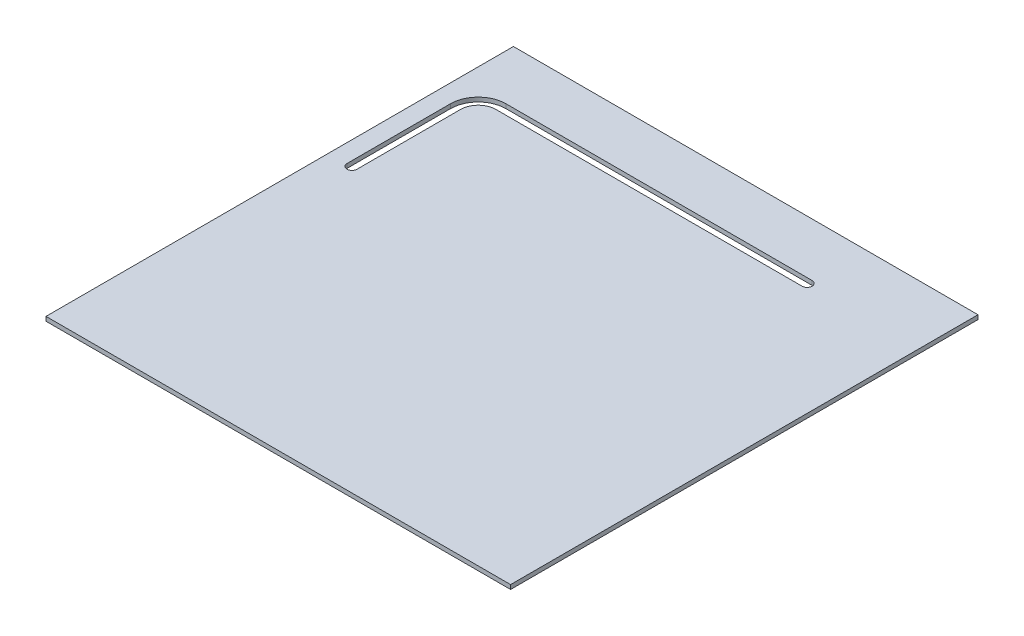
ISO-10303-21;
HEADER;
FILE_DESCRIPTION(('STEP AP214'),'2;1');
FILE_NAME('part.step','',(''),(''),'','','');
FILE_SCHEMA(('AUTOMOTIVE_DESIGN { 1 0 10303 214 1 1 1 1 }'));
ENDSEC;
DATA;
#1=APPLICATION_CONTEXT('core data for automotive mechanical design processes');
#2=APPLICATION_PROTOCOL_DEFINITION('international standard','automotive_design',2000,#1);
#3=PRODUCT_CONTEXT('',#1,'mechanical');
#4=PRODUCT('Part','Part','',(#3));
#5=PRODUCT_RELATED_PRODUCT_CATEGORY('part','',(#4));
#6=PRODUCT_DEFINITION_FORMATION('','',#4);
#7=PRODUCT_DEFINITION_CONTEXT('part definition',#1,'design');
#8=PRODUCT_DEFINITION('design','',#6,#7);
#9=PRODUCT_DEFINITION_SHAPE('','',#8);
#10=(LENGTH_UNIT() NAMED_UNIT(*) SI_UNIT(.MILLI.,.METRE.));
#11=(NAMED_UNIT(*) PLANE_ANGLE_UNIT() SI_UNIT($,.RADIAN.));
#12=(NAMED_UNIT(*) SI_UNIT($,.STERADIAN.) SOLID_ANGLE_UNIT());
#13=UNCERTAINTY_MEASURE_WITH_UNIT(LENGTH_MEASURE(1.E-05),#10,'distance_accuracy_value','');
#14=(GEOMETRIC_REPRESENTATION_CONTEXT(3) GLOBAL_UNCERTAINTY_ASSIGNED_CONTEXT((#13)) GLOBAL_UNIT_ASSIGNED_CONTEXT((#10,
#11,#12)) REPRESENTATION_CONTEXT('',''));
#15=CARTESIAN_POINT('',(0.,0.,0.));
#16=DIRECTION('',(0.,0.,1.));
#17=DIRECTION('',(1.,0.,0.));
#18=AXIS2_PLACEMENT_3D('',#15,#16,#17);
#19=CARTESIAN_POINT('',(0.,12.,0.));
#20=DIRECTION('',(0.,1.,0.));
#21=DIRECTION('',(0.,0.,-1.));
#22=AXIS2_PLACEMENT_3D('',#19,#20,#21);
#23=PLANE('',#22);
#24=CARTESIAN_POINT('',(190.5,12.,66.27));
#25=DIRECTION('',(0.,1.,0.));
#26=DIRECTION('',(0.,0.,1.));
#27=AXIS2_PLACEMENT_3D('',#24,#25,#26);
#28=CIRCLE('',#27,2.5);
#29=CARTESIAN_POINT('',(190.5,12.,68.77));
#30=VERTEX_POINT('',#29);
#31=EDGE_CURVE('E235',#30,#30,#28,.T.);
#32=ORIENTED_EDGE('',*,*,#31,.T.);
#33=EDGE_LOOP('',(#32));
#34=FACE_BOUND('',#33,.T.);
#35=CARTESIAN_POINT('',(135.5,12.,66.27));
#36=DIRECTION('',(0.,1.,0.));
#37=DIRECTION('',(0.,0.,1.));
#38=AXIS2_PLACEMENT_3D('',#35,#36,#37);
#39=CIRCLE('',#38,2.5);
#40=CARTESIAN_POINT('',(135.5,12.,68.77));
#41=VERTEX_POINT('',#40);
#42=EDGE_CURVE('E229',#41,#41,#39,.T.);
#43=ORIENTED_EDGE('',*,*,#42,.T.);
#44=EDGE_LOOP('',(#43));
#45=FACE_BOUND('',#44,.T.);
#46=CARTESIAN_POINT('',(80.5,12.,66.27));
#47=DIRECTION('',(0.,1.,0.));
#48=DIRECTION('',(0.,0.,1.));
#49=AXIS2_PLACEMENT_3D('',#46,#47,#48);
#50=CIRCLE('',#49,2.5);
#51=CARTESIAN_POINT('',(80.5,12.,68.77));
#52=VERTEX_POINT('',#51);
#53=EDGE_CURVE('E223',#52,#52,#50,.T.);
#54=ORIENTED_EDGE('',*,*,#53,.T.);
#55=EDGE_LOOP('',(#54));
#56=FACE_BOUND('',#55,.T.);
#57=CARTESIAN_POINT('',(25.5,12.,66.27));
#58=DIRECTION('',(0.,1.,0.));
#59=DIRECTION('',(0.,0.,1.));
#60=AXIS2_PLACEMENT_3D('',#57,#58,#59);
#61=CIRCLE('',#60,2.5);
#62=CARTESIAN_POINT('',(25.5,12.,68.77));
#63=VERTEX_POINT('',#62);
#64=EDGE_CURVE('E217',#63,#63,#61,.T.);
#65=ORIENTED_EDGE('',*,*,#64,.T.);
#66=EDGE_LOOP('',(#65));
#67=FACE_BOUND('',#66,.T.);
#68=CARTESIAN_POINT('',(-29.5,12.,66.27));
#69=DIRECTION('',(0.,1.,0.));
#70=DIRECTION('',(0.,0.,1.));
#71=AXIS2_PLACEMENT_3D('',#68,#69,#70);
#72=CIRCLE('',#71,2.5);
#73=CARTESIAN_POINT('',(-29.5,12.,68.77));
#74=VERTEX_POINT('',#73);
#75=EDGE_CURVE('E211',#74,#74,#72,.T.);
#76=ORIENTED_EDGE('',*,*,#75,.T.);
#77=EDGE_LOOP('',(#76));
#78=FACE_BOUND('',#77,.T.);
#79=CARTESIAN_POINT('',(-84.5,12.,66.27));
#80=DIRECTION('',(0.,1.,0.));
#81=DIRECTION('',(0.,0.,1.));
#82=AXIS2_PLACEMENT_3D('',#79,#80,#81);
#83=CIRCLE('',#82,2.5);
#84=CARTESIAN_POINT('',(-84.5,12.,68.77));
#85=VERTEX_POINT('',#84);
#86=EDGE_CURVE('E205',#85,#85,#83,.T.);
#87=ORIENTED_EDGE('',*,*,#86,.T.);
#88=EDGE_LOOP('',(#87));
#89=FACE_BOUND('',#88,.T.);
#90=CARTESIAN_POINT('',(-139.5,12.,66.27));
#91=DIRECTION('',(0.,1.,0.));
#92=DIRECTION('',(0.,0.,1.));
#93=AXIS2_PLACEMENT_3D('',#90,#91,#92);
#94=CIRCLE('',#93,2.5);
#95=CARTESIAN_POINT('',(-139.5,12.,68.77));
#96=VERTEX_POINT('',#95);
#97=EDGE_CURVE('E176',#96,#96,#94,.T.);
#98=ORIENTED_EDGE('',*,*,#97,.T.);
#99=EDGE_LOOP('',(#98));
#100=FACE_BOUND('',#99,.T.);
#101=CARTESIAN_POINT('',(-235.5,12.,-239.73));
#102=DIRECTION('',(0.,1.,0.));
#103=DIRECTION('',(0.,0.,1.));
#104=AXIS2_PLACEMENT_3D('',#101,#102,#103);
#105=CIRCLE('',#104,25.);
#106=CARTESIAN_POINT('',(-235.5,12.,-264.73));
#107=VERTEX_POINT('',#106);
#108=CARTESIAN_POINT('',(-260.5,12.,-239.73));
#109=VERTEX_POINT('',#108);
#110=EDGE_CURVE('E196',#107,#109,#105,.T.);
#111=ORIENTED_EDGE('',*,*,#110,.F.);
#112=DIRECTION('',(-1.,0.,0.));
#113=VECTOR('',#112,1.);
#114=CARTESIAN_POINT('',(0.,12.,-264.73));
#115=LINE('',#114,#113);
#116=CARTESIAN_POINT('',(195.5,12.,-264.73));
#117=VERTEX_POINT('',#116);
#118=EDGE_CURVE('E193',#117,#107,#115,.T.);
#119=ORIENTED_EDGE('',*,*,#118,.F.);
#120=CARTESIAN_POINT('',(195.5,12.,-271.73));
#121=DIRECTION('',(0.,1.,0.));
#122=DIRECTION('',(0.,0.,1.));
#123=AXIS2_PLACEMENT_3D('',#120,#121,#122);
#124=CIRCLE('',#123,7.);
#125=CARTESIAN_POINT('',(195.5,12.,-278.73));
#126=VERTEX_POINT('',#125);
#127=EDGE_CURVE('E190',#126,#117,#124,.F.);
#128=ORIENTED_EDGE('',*,*,#127,.F.);
#129=DIRECTION('',(-1.,0.,0.));
#130=VECTOR('',#129,1.);
#131=CARTESIAN_POINT('',(0.,12.,-278.73));
#132=LINE('',#131,#130);
#133=CARTESIAN_POINT('',(-235.5,12.,-278.73));
#134=VERTEX_POINT('',#133);
#135=EDGE_CURVE('E187',#126,#134,#132,.T.);
#136=ORIENTED_EDGE('',*,*,#135,.T.);
#137=CARTESIAN_POINT('',(-235.5,12.,-239.73));
#138=DIRECTION('',(0.,1.,0.));
#139=DIRECTION('',(0.,0.,1.));
#140=AXIS2_PLACEMENT_3D('',#137,#138,#139);
#141=CIRCLE('',#140,39.);
#142=CARTESIAN_POINT('',(-274.5,12.,-239.73));
#143=VERTEX_POINT('',#142);
#144=EDGE_CURVE('E184',#134,#143,#141,.T.);
#145=ORIENTED_EDGE('',*,*,#144,.T.);
#146=DIRECTION('',(0.,0.,1.));
#147=VECTOR('',#146,1.);
#148=CARTESIAN_POINT('',(-274.5,12.,-1.04593624815928E-13));
#149=LINE('',#148,#147);
#150=CARTESIAN_POINT('',(-274.5,12.,-94.0441511751126));
#151=VERTEX_POINT('',#150);
#152=EDGE_CURVE('E181',#143,#151,#149,.T.);
#153=ORIENTED_EDGE('',*,*,#152,.T.);
#154=CARTESIAN_POINT('',(-267.5,12.,-94.0441511751126));
#155=DIRECTION('',(0.,1.,0.));
#156=DIRECTION('',(0.,0.,1.));
#157=AXIS2_PLACEMENT_3D('',#154,#155,#156);
#158=CIRCLE('',#157,7.);
#159=CARTESIAN_POINT('',(-260.5,12.,-94.0441511751126));
#160=VERTEX_POINT('',#159);
#161=EDGE_CURVE('E178',#151,#160,#158,.T.);
#162=ORIENTED_EDGE('',*,*,#161,.T.);
#163=DIRECTION('',(0.,0.,-1.));
#164=VECTOR('',#163,1.);
#165=CARTESIAN_POINT('',(-260.5,12.,0.));
#166=LINE('',#165,#164);
#167=EDGE_CURVE('E163',#160,#109,#166,.T.);
#168=ORIENTED_EDGE('',*,*,#167,.T.);
#169=EDGE_LOOP('',(#111,#119,#128,#136,#145,#153,#162,#168));
#170=FACE_BOUND('',#169,.T.);
#171=DIRECTION('',(0.,0.,-1.));
#172=VECTOR('',#171,1.);
#173=CARTESIAN_POINT('',(354.,12.,304.23));
#174=LINE('',#173,#172);
#175=CARTESIAN_POINT('',(354.,12.,304.23));
#176=VERTEX_POINT('',#175);
#177=CARTESIAN_POINT('',(354.,12.,-353.77));
#178=VERTEX_POINT('',#177);
#179=EDGE_CURVE('E120',#176,#178,#174,.T.);
#180=ORIENTED_EDGE('',*,*,#179,.F.);
#181=DIRECTION('',(1.,0.,0.));
#182=VECTOR('',#181,1.);
#183=CARTESIAN_POINT('',(-300.,12.,304.23));
#184=LINE('',#183,#182);
#185=CARTESIAN_POINT('',(-300.,12.,304.23));
#186=VERTEX_POINT('',#185);
#187=EDGE_CURVE('E25',#186,#176,#184,.T.);
#188=ORIENTED_EDGE('',*,*,#187,.F.);
#189=DIRECTION('',(0.,0.,1.));
#190=VECTOR('',#189,1.);
#191=CARTESIAN_POINT('',(-300.,12.,304.23));
#192=LINE('',#191,#190);
#193=CARTESIAN_POINT('',(-300.,12.,-353.77));
#194=VERTEX_POINT('',#193);
#195=EDGE_CURVE('E115',#194,#186,#192,.T.);
#196=ORIENTED_EDGE('',*,*,#195,.F.);
#197=DIRECTION('',(-1.,0.,0.));
#198=VECTOR('',#197,1.);
#199=CARTESIAN_POINT('',(354.,12.,-353.77));
#200=LINE('',#199,#198);
#201=EDGE_CURVE('E125',#178,#194,#200,.T.);
#202=ORIENTED_EDGE('',*,*,#201,.F.);
#203=EDGE_LOOP('',(#180,#188,#196,#202));
#204=FACE_BOUND('',#203,.T.);
#205=ADVANCED_FACE('F17',(#34,#45,#56,#67,#78,#89,#100,#170,#204),#23,.F.);
#206=CARTESIAN_POINT('',(-300.,12.,304.23));
#207=DIRECTION('',(1.,0.,0.));
#208=DIRECTION('',(0.,0.,-1.));
#209=AXIS2_PLACEMENT_3D('',#206,#207,#208);
#210=PLANE('',#209);
#211=DIRECTION('',(0.,0.,1.));
#212=VECTOR('',#211,1.);
#213=CARTESIAN_POINT('',(-300.,18.,304.23));
#214=LINE('',#213,#212);
#215=CARTESIAN_POINT('',(-300.,18.,-353.77));
#216=VERTEX_POINT('',#215);
#217=CARTESIAN_POINT('',(-300.,18.,304.23));
#218=VERTEX_POINT('',#217);
#219=EDGE_CURVE('E199',#216,#218,#214,.T.);
#220=ORIENTED_EDGE('',*,*,#219,.F.);
#221=DIRECTION('',(0.,1.,0.));
#222=VECTOR('',#221,1.);
#223=CARTESIAN_POINT('',(-300.,12.,-353.77));
#224=LINE('',#223,#222);
#225=EDGE_CURVE('E135',#194,#216,#224,.T.);
#226=ORIENTED_EDGE('',*,*,#225,.F.);
#227=ORIENTED_EDGE('',*,*,#195,.T.);
#228=DIRECTION('',(0.,1.,0.));
#229=VECTOR('',#228,1.);
#230=CARTESIAN_POINT('',(-300.,12.,304.23));
#231=LINE('',#230,#229);
#232=EDGE_CURVE('E11',#186,#218,#231,.T.);
#233=ORIENTED_EDGE('',*,*,#232,.T.);
#234=EDGE_LOOP('',(#220,#226,#227,#233));
#235=FACE_BOUND('',#234,.T.);
#236=ADVANCED_FACE('F19',(#235),#210,.F.);
#237=CARTESIAN_POINT('',(-300.,12.,304.23));
#238=DIRECTION('',(0.,0.,-1.));
#239=DIRECTION('',(-1.,0.,0.));
#240=AXIS2_PLACEMENT_3D('',#237,#238,#239);
#241=PLANE('',#240);
#242=DIRECTION('',(1.,0.,0.));
#243=VECTOR('',#242,1.);
#244=CARTESIAN_POINT('',(-300.,18.,304.23));
#245=LINE('',#244,#243);
#246=CARTESIAN_POINT('',(354.,18.,304.23));
#247=VERTEX_POINT('',#246);
#248=EDGE_CURVE('E240',#218,#247,#245,.T.);
#249=ORIENTED_EDGE('',*,*,#248,.F.);
#250=ORIENTED_EDGE('',*,*,#232,.F.);
#251=ORIENTED_EDGE('',*,*,#187,.T.);
#252=DIRECTION('',(0.,1.,0.));
#253=VECTOR('',#252,1.);
#254=CARTESIAN_POINT('',(354.,12.,304.23));
#255=LINE('',#254,#253);
#256=EDGE_CURVE('E110',#176,#247,#255,.T.);
#257=ORIENTED_EDGE('',*,*,#256,.T.);
#258=EDGE_LOOP('',(#249,#250,#251,#257));
#259=FACE_BOUND('',#258,.T.);
#260=ADVANCED_FACE('F109',(#259),#241,.F.);
#261=CARTESIAN_POINT('',(0.,18.,0.));
#262=DIRECTION('',(0.,1.,0.));
#263=DIRECTION('',(0.,0.,-1.));
#264=AXIS2_PLACEMENT_3D('',#261,#262,#263);
#265=PLANE('',#264);
#266=CARTESIAN_POINT('',(195.5,18.,-271.73));
#267=DIRECTION('',(0.,1.,0.));
#268=DIRECTION('',(0.,0.,1.));
#269=AXIS2_PLACEMENT_3D('',#266,#267,#268);
#270=CIRCLE('',#269,7.);
#271=CARTESIAN_POINT('',(195.5,18.,-264.73));
#272=VERTEX_POINT('',#271);
#273=CARTESIAN_POINT('',(195.5,18.,-278.73));
#274=VERTEX_POINT('',#273);
#275=EDGE_CURVE('E138',#272,#274,#270,.T.);
#276=ORIENTED_EDGE('',*,*,#275,.F.);
#277=DIRECTION('',(1.,0.,0.));
#278=VECTOR('',#277,1.);
#279=CARTESIAN_POINT('',(195.5,18.,-264.73));
#280=LINE('',#279,#278);
#281=CARTESIAN_POINT('',(-235.5,18.,-264.73));
#282=VERTEX_POINT('',#281);
#283=EDGE_CURVE('E157',#282,#272,#280,.T.);
#284=ORIENTED_EDGE('',*,*,#283,.F.);
#285=CARTESIAN_POINT('',(-235.5,18.,-239.73));
#286=DIRECTION('',(0.,-1.,0.));
#287=DIRECTION('',(0.,0.,1.));
#288=AXIS2_PLACEMENT_3D('',#285,#286,#287);
#289=CIRCLE('',#288,25.);
#290=CARTESIAN_POINT('',(-260.5,18.,-239.73));
#291=VERTEX_POINT('',#290);
#292=EDGE_CURVE('E154',#291,#282,#289,.T.);
#293=ORIENTED_EDGE('',*,*,#292,.F.);
#294=DIRECTION('',(0.,0.,-1.));
#295=VECTOR('',#294,1.);
#296=CARTESIAN_POINT('',(-260.5,18.,-94.0441511751126));
#297=LINE('',#296,#295);
#298=CARTESIAN_POINT('',(-260.5,18.,-94.0441511751126));
#299=VERTEX_POINT('',#298);
#300=EDGE_CURVE('E152',#299,#291,#297,.T.);
#301=ORIENTED_EDGE('',*,*,#300,.F.);
#302=CARTESIAN_POINT('',(-267.5,18.,-94.0441511751126));
#303=DIRECTION('',(0.,1.,0.));
#304=DIRECTION('',(0.,0.,1.));
#305=AXIS2_PLACEMENT_3D('',#302,#303,#304);
#306=CIRCLE('',#305,7.);
#307=CARTESIAN_POINT('',(-274.5,18.,-94.0441511751126));
#308=VERTEX_POINT('',#307);
#309=EDGE_CURVE('E149',#308,#299,#306,.T.);
#310=ORIENTED_EDGE('',*,*,#309,.F.);
#311=DIRECTION('',(0.,0.,1.));
#312=VECTOR('',#311,1.);
#313=CARTESIAN_POINT('',(-274.5,18.,-239.73));
#314=LINE('',#313,#312);
#315=CARTESIAN_POINT('',(-274.5,18.,-239.73));
#316=VERTEX_POINT('',#315);
#317=EDGE_CURVE('E146',#316,#308,#314,.T.);
#318=ORIENTED_EDGE('',*,*,#317,.F.);
#319=CARTESIAN_POINT('',(-235.5,18.,-239.73));
#320=DIRECTION('',(0.,1.,0.));
#321=DIRECTION('',(0.,0.,1.));
#322=AXIS2_PLACEMENT_3D('',#319,#320,#321);
#323=CIRCLE('',#322,39.);
#324=CARTESIAN_POINT('',(-235.5,18.,-278.73));
#325=VERTEX_POINT('',#324);
#326=EDGE_CURVE('E144',#325,#316,#323,.T.);
#327=ORIENTED_EDGE('',*,*,#326,.F.);
#328=DIRECTION('',(-1.,0.,0.));
#329=VECTOR('',#328,1.);
#330=CARTESIAN_POINT('',(-235.5,18.,-278.73));
#331=LINE('',#330,#329);
#332=EDGE_CURVE('E142',#274,#325,#331,.T.);
#333=ORIENTED_EDGE('',*,*,#332,.F.);
#334=EDGE_LOOP('',(#276,#284,#293,#301,#310,#318,#327,#333));
#335=FACE_BOUND('',#334,.T.);
#336=ORIENTED_EDGE('',*,*,#248,.T.);
#337=DIRECTION('',(0.,0.,-1.));
#338=VECTOR('',#337,1.);
#339=CARTESIAN_POINT('',(354.,18.,304.23));
#340=LINE('',#339,#338);
#341=CARTESIAN_POINT('',(354.,18.,-353.77));
#342=VERTEX_POINT('',#341);
#343=EDGE_CURVE('E123',#247,#342,#340,.T.);
#344=ORIENTED_EDGE('',*,*,#343,.T.);
#345=DIRECTION('',(-1.,0.,0.));
#346=VECTOR('',#345,1.);
#347=CARTESIAN_POINT('',(354.,18.,-353.77));
#348=LINE('',#347,#346);
#349=EDGE_CURVE('E128',#342,#216,#348,.T.);
#350=ORIENTED_EDGE('',*,*,#349,.T.);
#351=ORIENTED_EDGE('',*,*,#219,.T.);
#352=EDGE_LOOP('',(#336,#344,#350,#351));
#353=FACE_BOUND('',#352,.T.);
#354=ADVANCED_FACE('F244',(#335,#353),#265,.T.);
#355=CARTESIAN_POINT('',(-260.5,14.,0.));
#356=DIRECTION('',(1.,0.,0.));
#357=DIRECTION('',(0.,0.,-1.));
#358=AXIS2_PLACEMENT_3D('',#355,#356,#357);
#359=PLANE('',#358);
#360=ORIENTED_EDGE('',*,*,#167,.F.);
#361=DIRECTION('',(0.,-1.,0.));
#362=VECTOR('',#361,1.);
#363=CARTESIAN_POINT('',(-260.5,14.,-94.0441511751126));
#364=LINE('',#363,#362);
#365=EDGE_CURVE('E173',#299,#160,#364,.T.);
#366=ORIENTED_EDGE('',*,*,#365,.F.);
#367=ORIENTED_EDGE('',*,*,#300,.T.);
#368=DIRECTION('',(0.,-1.,0.));
#369=VECTOR('',#368,1.);
#370=CARTESIAN_POINT('',(-260.5,14.,-239.73));
#371=LINE('',#370,#369);
#372=EDGE_CURVE('E40',#291,#109,#371,.T.);
#373=ORIENTED_EDGE('',*,*,#372,.T.);
#374=EDGE_LOOP('',(#360,#366,#367,#373));
#375=FACE_BOUND('',#374,.T.);
#376=ADVANCED_FACE('F274',(#375),#359,.F.);
#377=CARTESIAN_POINT('',(-267.5,14.,-94.0441511751126));
#378=DIRECTION('',(0.,-1.,0.));
#379=DIRECTION('',(0.,0.,1.));
#380=AXIS2_PLACEMENT_3D('',#377,#378,#379);
#381=CYLINDRICAL_SURFACE('',#380,7.);
#382=ORIENTED_EDGE('',*,*,#161,.F.);
#383=DIRECTION('',(0.,-1.,0.));
#384=VECTOR('',#383,1.);
#385=CARTESIAN_POINT('',(-274.5,14.,-94.0441511751126));
#386=LINE('',#385,#384);
#387=EDGE_CURVE('E171',#308,#151,#386,.T.);
#388=ORIENTED_EDGE('',*,*,#387,.F.);
#389=ORIENTED_EDGE('',*,*,#309,.T.);
#390=ORIENTED_EDGE('',*,*,#365,.T.);
#391=EDGE_LOOP('',(#382,#388,#389,#390));
#392=FACE_BOUND('',#391,.T.);
#393=ADVANCED_FACE('F298',(#392),#381,.F.);
#394=CARTESIAN_POINT('',(-274.5,14.,-1.04593624815928E-13));
#395=DIRECTION('',(-1.,0.,0.));
#396=DIRECTION('',(0.,0.,1.));
#397=AXIS2_PLACEMENT_3D('',#394,#395,#396);
#398=PLANE('',#397);
#399=ORIENTED_EDGE('',*,*,#152,.F.);
#400=DIRECTION('',(0.,-1.,0.));
#401=VECTOR('',#400,1.);
#402=CARTESIAN_POINT('',(-274.5,14.,-239.73));
#403=LINE('',#402,#401);
#404=EDGE_CURVE('E169',#316,#143,#403,.T.);
#405=ORIENTED_EDGE('',*,*,#404,.F.);
#406=ORIENTED_EDGE('',*,*,#317,.T.);
#407=ORIENTED_EDGE('',*,*,#387,.T.);
#408=EDGE_LOOP('',(#399,#405,#406,#407));
#409=FACE_BOUND('',#408,.T.);
#410=ADVANCED_FACE('F306',(#409),#398,.F.);
#411=CARTESIAN_POINT('',(-235.5,14.,-239.73));
#412=DIRECTION('',(0.,-1.,0.));
#413=DIRECTION('',(0.,0.,1.));
#414=AXIS2_PLACEMENT_3D('',#411,#412,#413);
#415=CYLINDRICAL_SURFACE('',#414,39.);
#416=ORIENTED_EDGE('',*,*,#144,.F.);
#417=DIRECTION('',(0.,-1.,0.));
#418=VECTOR('',#417,1.);
#419=CARTESIAN_POINT('',(-235.5,14.,-278.73));
#420=LINE('',#419,#418);
#421=EDGE_CURVE('E32',#325,#134,#420,.T.);
#422=ORIENTED_EDGE('',*,*,#421,.F.);
#423=ORIENTED_EDGE('',*,*,#326,.T.);
#424=ORIENTED_EDGE('',*,*,#404,.T.);
#425=EDGE_LOOP('',(#416,#422,#423,#424));
#426=FACE_BOUND('',#425,.T.);
#427=ADVANCED_FACE('F315',(#426),#415,.F.);
#428=CARTESIAN_POINT('',(0.,14.,-278.73));
#429=DIRECTION('',(0.,0.,-1.));
#430=DIRECTION('',(-1.,0.,0.));
#431=AXIS2_PLACEMENT_3D('',#428,#429,#430);
#432=PLANE('',#431);
#433=ORIENTED_EDGE('',*,*,#135,.F.);
#434=DIRECTION('',(0.,-1.,0.));
#435=VECTOR('',#434,1.);
#436=CARTESIAN_POINT('',(195.5,14.,-278.73));
#437=LINE('',#436,#435);
#438=EDGE_CURVE('E166',#274,#126,#437,.T.);
#439=ORIENTED_EDGE('',*,*,#438,.F.);
#440=ORIENTED_EDGE('',*,*,#332,.T.);
#441=ORIENTED_EDGE('',*,*,#421,.T.);
#442=EDGE_LOOP('',(#433,#439,#440,#441));
#443=FACE_BOUND('',#442,.T.);
#444=ADVANCED_FACE('F324',(#443),#432,.F.);
#445=CARTESIAN_POINT('',(195.5,14.,-271.73));
#446=DIRECTION('',(0.,-1.,0.));
#447=DIRECTION('',(0.,0.,1.));
#448=AXIS2_PLACEMENT_3D('',#445,#446,#447);
#449=CYLINDRICAL_SURFACE('',#448,7.);
#450=ORIENTED_EDGE('',*,*,#127,.T.);
#451=DIRECTION('',(0.,-1.,0.));
#452=VECTOR('',#451,1.);
#453=CARTESIAN_POINT('',(195.5,14.,-264.73));
#454=LINE('',#453,#452);
#455=EDGE_CURVE('E164',#272,#117,#454,.T.);
#456=ORIENTED_EDGE('',*,*,#455,.F.);
#457=ORIENTED_EDGE('',*,*,#275,.T.);
#458=ORIENTED_EDGE('',*,*,#438,.T.);
#459=EDGE_LOOP('',(#450,#456,#457,#458));
#460=FACE_BOUND('',#459,.T.);
#461=ADVANCED_FACE('F332',(#460),#449,.F.);
#462=CARTESIAN_POINT('',(0.,14.,-264.73));
#463=DIRECTION('',(0.,0.,-1.));
#464=DIRECTION('',(-1.,0.,0.));
#465=AXIS2_PLACEMENT_3D('',#462,#463,#464);
#466=PLANE('',#465);
#467=ORIENTED_EDGE('',*,*,#118,.T.);
#468=DIRECTION('',(0.,-1.,0.));
#469=VECTOR('',#468,1.);
#470=CARTESIAN_POINT('',(-235.5,14.,-264.73));
#471=LINE('',#470,#469);
#472=EDGE_CURVE('E161',#282,#107,#471,.T.);
#473=ORIENTED_EDGE('',*,*,#472,.F.);
#474=ORIENTED_EDGE('',*,*,#283,.T.);
#475=ORIENTED_EDGE('',*,*,#455,.T.);
#476=EDGE_LOOP('',(#467,#473,#474,#475));
#477=FACE_BOUND('',#476,.T.);
#478=ADVANCED_FACE('F341',(#477),#466,.T.);
#479=CARTESIAN_POINT('',(-235.5,14.,-239.73));
#480=DIRECTION('',(0.,-1.,0.));
#481=DIRECTION('',(0.,0.,1.));
#482=AXIS2_PLACEMENT_3D('',#479,#480,#481);
#483=CYLINDRICAL_SURFACE('',#482,25.);
#484=ORIENTED_EDGE('',*,*,#110,.T.);
#485=ORIENTED_EDGE('',*,*,#372,.F.);
#486=ORIENTED_EDGE('',*,*,#292,.T.);
#487=ORIENTED_EDGE('',*,*,#472,.T.);
#488=EDGE_LOOP('',(#484,#485,#486,#487));
#489=FACE_BOUND('',#488,.T.);
#490=ADVANCED_FACE('F350',(#489),#483,.T.);
#491=CARTESIAN_POINT('',(-139.5,14.,66.27));
#492=DIRECTION('',(0.,-1.,0.));
#493=DIRECTION('',(0.,0.,1.));
#494=AXIS2_PLACEMENT_3D('',#491,#492,#493);
#495=CYLINDRICAL_SURFACE('',#494,2.5);
#496=CARTESIAN_POINT('',(-139.5,14.,66.27));
#497=DIRECTION('',(0.,1.,0.));
#498=DIRECTION('',(0.,0.,1.));
#499=AXIS2_PLACEMENT_3D('',#496,#497,#498);
#500=CIRCLE('',#499,2.5);
#501=CARTESIAN_POINT('',(-139.5,14.,68.77));
#502=VERTEX_POINT('',#501);
#503=EDGE_CURVE('E202',#502,#502,#500,.T.);
#504=ORIENTED_EDGE('',*,*,#503,.T.);
#505=EDGE_LOOP('',(#504));
#506=FACE_BOUND('',#505,.T.);
#507=ORIENTED_EDGE('',*,*,#97,.F.);
#508=EDGE_LOOP('',(#507));
#509=FACE_BOUND('',#508,.T.);
#510=ADVANCED_FACE('F359',(#506,#509),#495,.F.);
#511=CARTESIAN_POINT('',(0.,14.,0.));
#512=DIRECTION('',(0.,-1.,0.));
#513=DIRECTION('',(0.,0.,1.));
#514=AXIS2_PLACEMENT_3D('',#511,#512,#513);
#515=PLANE('',#514);
#516=ORIENTED_EDGE('',*,*,#503,.F.);
#517=EDGE_LOOP('',(#516));
#518=FACE_BOUND('',#517,.T.);
#519=ADVANCED_FACE('F368',(#518),#515,.T.);
#520=CARTESIAN_POINT('',(-84.5,14.,66.27));
#521=DIRECTION('',(0.,-1.,0.));
#522=DIRECTION('',(0.,0.,1.));
#523=AXIS2_PLACEMENT_3D('',#520,#521,#522);
#524=CYLINDRICAL_SURFACE('',#523,2.5);
#525=CARTESIAN_POINT('',(-84.5,14.,66.27));
#526=DIRECTION('',(0.,1.,0.));
#527=DIRECTION('',(0.,0.,1.));
#528=AXIS2_PLACEMENT_3D('',#525,#526,#527);
#529=CIRCLE('',#528,2.5);
#530=CARTESIAN_POINT('',(-84.5,14.,68.77));
#531=VERTEX_POINT('',#530);
#532=EDGE_CURVE('E208',#531,#531,#529,.T.);
#533=ORIENTED_EDGE('',*,*,#532,.T.);
#534=EDGE_LOOP('',(#533));
#535=FACE_BOUND('',#534,.T.);
#536=ORIENTED_EDGE('',*,*,#86,.F.);
#537=EDGE_LOOP('',(#536));
#538=FACE_BOUND('',#537,.T.);
#539=ADVANCED_FACE('F377',(#535,#538),#524,.F.);
#540=CARTESIAN_POINT('',(0.,14.,0.));
#541=DIRECTION('',(0.,-1.,0.));
#542=DIRECTION('',(0.,0.,1.));
#543=AXIS2_PLACEMENT_3D('',#540,#541,#542);
#544=PLANE('',#543);
#545=ORIENTED_EDGE('',*,*,#532,.F.);
#546=EDGE_LOOP('',(#545));
#547=FACE_BOUND('',#546,.T.);
#548=ADVANCED_FACE('F386',(#547),#544,.T.);
#549=CARTESIAN_POINT('',(-29.5,14.,66.27));
#550=DIRECTION('',(0.,-1.,0.));
#551=DIRECTION('',(0.,0.,1.));
#552=AXIS2_PLACEMENT_3D('',#549,#550,#551);
#553=CYLINDRICAL_SURFACE('',#552,2.5);
#554=CARTESIAN_POINT('',(-29.5,14.,66.27));
#555=DIRECTION('',(0.,1.,0.));
#556=DIRECTION('',(0.,0.,1.));
#557=AXIS2_PLACEMENT_3D('',#554,#555,#556);
#558=CIRCLE('',#557,2.5);
#559=CARTESIAN_POINT('',(-29.5,14.,68.77));
#560=VERTEX_POINT('',#559);
#561=EDGE_CURVE('E214',#560,#560,#558,.T.);
#562=ORIENTED_EDGE('',*,*,#561,.T.);
#563=EDGE_LOOP('',(#562));
#564=FACE_BOUND('',#563,.T.);
#565=ORIENTED_EDGE('',*,*,#75,.F.);
#566=EDGE_LOOP('',(#565));
#567=FACE_BOUND('',#566,.T.);
#568=ADVANCED_FACE('F395',(#564,#567),#553,.F.);
#569=CARTESIAN_POINT('',(0.,14.,0.));
#570=DIRECTION('',(0.,-1.,0.));
#571=DIRECTION('',(0.,0.,1.));
#572=AXIS2_PLACEMENT_3D('',#569,#570,#571);
#573=PLANE('',#572);
#574=ORIENTED_EDGE('',*,*,#561,.F.);
#575=EDGE_LOOP('',(#574));
#576=FACE_BOUND('',#575,.T.);
#577=ADVANCED_FACE('F404',(#576),#573,.T.);
#578=CARTESIAN_POINT('',(25.5,14.,66.27));
#579=DIRECTION('',(0.,-1.,0.));
#580=DIRECTION('',(0.,0.,1.));
#581=AXIS2_PLACEMENT_3D('',#578,#579,#580);
#582=CYLINDRICAL_SURFACE('',#581,2.5);
#583=CARTESIAN_POINT('',(25.5,14.,66.27));
#584=DIRECTION('',(0.,1.,0.));
#585=DIRECTION('',(0.,0.,1.));
#586=AXIS2_PLACEMENT_3D('',#583,#584,#585);
#587=CIRCLE('',#586,2.5);
#588=CARTESIAN_POINT('',(25.5,14.,68.77));
#589=VERTEX_POINT('',#588);
#590=EDGE_CURVE('E220',#589,#589,#587,.T.);
#591=ORIENTED_EDGE('',*,*,#590,.T.);
#592=EDGE_LOOP('',(#591));
#593=FACE_BOUND('',#592,.T.);
#594=ORIENTED_EDGE('',*,*,#64,.F.);
#595=EDGE_LOOP('',(#594));
#596=FACE_BOUND('',#595,.T.);
#597=ADVANCED_FACE('F413',(#593,#596),#582,.F.);
#598=CARTESIAN_POINT('',(0.,14.,0.));
#599=DIRECTION('',(0.,-1.,0.));
#600=DIRECTION('',(0.,0.,1.));
#601=AXIS2_PLACEMENT_3D('',#598,#599,#600);
#602=PLANE('',#601);
#603=ORIENTED_EDGE('',*,*,#590,.F.);
#604=EDGE_LOOP('',(#603));
#605=FACE_BOUND('',#604,.T.);
#606=ADVANCED_FACE('F422',(#605),#602,.T.);
#607=CARTESIAN_POINT('',(80.5,14.,66.27));
#608=DIRECTION('',(0.,-1.,0.));
#609=DIRECTION('',(0.,0.,1.));
#610=AXIS2_PLACEMENT_3D('',#607,#608,#609);
#611=CYLINDRICAL_SURFACE('',#610,2.5);
#612=CARTESIAN_POINT('',(80.5,14.,66.27));
#613=DIRECTION('',(0.,1.,0.));
#614=DIRECTION('',(0.,0.,1.));
#615=AXIS2_PLACEMENT_3D('',#612,#613,#614);
#616=CIRCLE('',#615,2.5);
#617=CARTESIAN_POINT('',(80.5,14.,68.77));
#618=VERTEX_POINT('',#617);
#619=EDGE_CURVE('E226',#618,#618,#616,.T.);
#620=ORIENTED_EDGE('',*,*,#619,.T.);
#621=EDGE_LOOP('',(#620));
#622=FACE_BOUND('',#621,.T.);
#623=ORIENTED_EDGE('',*,*,#53,.F.);
#624=EDGE_LOOP('',(#623));
#625=FACE_BOUND('',#624,.T.);
#626=ADVANCED_FACE('F431',(#622,#625),#611,.F.);
#627=CARTESIAN_POINT('',(0.,14.,0.));
#628=DIRECTION('',(0.,-1.,0.));
#629=DIRECTION('',(0.,0.,1.));
#630=AXIS2_PLACEMENT_3D('',#627,#628,#629);
#631=PLANE('',#630);
#632=ORIENTED_EDGE('',*,*,#619,.F.);
#633=EDGE_LOOP('',(#632));
#634=FACE_BOUND('',#633,.T.);
#635=ADVANCED_FACE('F440',(#634),#631,.T.);
#636=CARTESIAN_POINT('',(135.5,14.,66.27));
#637=DIRECTION('',(0.,-1.,0.));
#638=DIRECTION('',(0.,0.,1.));
#639=AXIS2_PLACEMENT_3D('',#636,#637,#638);
#640=CYLINDRICAL_SURFACE('',#639,2.5);
#641=CARTESIAN_POINT('',(135.5,14.,66.27));
#642=DIRECTION('',(0.,1.,0.));
#643=DIRECTION('',(0.,0.,1.));
#644=AXIS2_PLACEMENT_3D('',#641,#642,#643);
#645=CIRCLE('',#644,2.5);
#646=CARTESIAN_POINT('',(135.5,14.,68.77));
#647=VERTEX_POINT('',#646);
#648=EDGE_CURVE('E232',#647,#647,#645,.T.);
#649=ORIENTED_EDGE('',*,*,#648,.T.);
#650=EDGE_LOOP('',(#649));
#651=FACE_BOUND('',#650,.T.);
#652=ORIENTED_EDGE('',*,*,#42,.F.);
#653=EDGE_LOOP('',(#652));
#654=FACE_BOUND('',#653,.T.);
#655=ADVANCED_FACE('F449',(#651,#654),#640,.F.);
#656=CARTESIAN_POINT('',(0.,14.,0.));
#657=DIRECTION('',(0.,-1.,0.));
#658=DIRECTION('',(0.,0.,1.));
#659=AXIS2_PLACEMENT_3D('',#656,#657,#658);
#660=PLANE('',#659);
#661=ORIENTED_EDGE('',*,*,#648,.F.);
#662=EDGE_LOOP('',(#661));
#663=FACE_BOUND('',#662,.T.);
#664=ADVANCED_FACE('F458',(#663),#660,.T.);
#665=CARTESIAN_POINT('',(190.5,14.,66.27));
#666=DIRECTION('',(0.,-1.,0.));
#667=DIRECTION('',(0.,0.,1.));
#668=AXIS2_PLACEMENT_3D('',#665,#666,#667);
#669=CYLINDRICAL_SURFACE('',#668,2.5);
#670=CARTESIAN_POINT('',(190.5,14.,66.27));
#671=DIRECTION('',(0.,1.,0.));
#672=DIRECTION('',(0.,0.,1.));
#673=AXIS2_PLACEMENT_3D('',#670,#671,#672);
#674=CIRCLE('',#673,2.5);
#675=CARTESIAN_POINT('',(190.5,14.,68.77));
#676=VERTEX_POINT('',#675);
#677=EDGE_CURVE('E160',#676,#676,#674,.T.);
#678=ORIENTED_EDGE('',*,*,#677,.T.);
#679=EDGE_LOOP('',(#678));
#680=FACE_BOUND('',#679,.T.);
#681=ORIENTED_EDGE('',*,*,#31,.F.);
#682=EDGE_LOOP('',(#681));
#683=FACE_BOUND('',#682,.T.);
#684=ADVANCED_FACE('F260',(#680,#683),#669,.F.);
#685=CARTESIAN_POINT('',(0.,14.,0.));
#686=DIRECTION('',(0.,-1.,0.));
#687=DIRECTION('',(0.,0.,1.));
#688=AXIS2_PLACEMENT_3D('',#685,#686,#687);
#689=PLANE('',#688);
#690=ORIENTED_EDGE('',*,*,#677,.F.);
#691=EDGE_LOOP('',(#690));
#692=FACE_BOUND('',#691,.T.);
#693=ADVANCED_FACE('F251',(#692),#689,.T.);
#694=CARTESIAN_POINT('',(354.,12.,-353.77));
#695=DIRECTION('',(0.,0.,-1.));
#696=DIRECTION('',(-1.,0.,0.));
#697=AXIS2_PLACEMENT_3D('',#694,#695,#696);
#698=PLANE('',#697);
#699=ORIENTED_EDGE('',*,*,#349,.F.);
#700=DIRECTION('',(0.,1.,0.));
#701=VECTOR('',#700,1.);
#702=CARTESIAN_POINT('',(354.,12.,-353.77));
#703=LINE('',#702,#701);
#704=EDGE_CURVE('E124',#178,#342,#703,.T.);
#705=ORIENTED_EDGE('',*,*,#704,.F.);
#706=ORIENTED_EDGE('',*,*,#201,.T.);
#707=ORIENTED_EDGE('',*,*,#225,.T.);
#708=EDGE_LOOP('',(#699,#705,#706,#707));
#709=FACE_BOUND('',#708,.T.);
#710=ADVANCED_FACE('F249',(#709),#698,.T.);
#711=CARTESIAN_POINT('',(354.,12.,304.23));
#712=DIRECTION('',(1.,0.,0.));
#713=DIRECTION('',(0.,0.,-1.));
#714=AXIS2_PLACEMENT_3D('',#711,#712,#713);
#715=PLANE('',#714);
#716=ORIENTED_EDGE('',*,*,#343,.F.);
#717=ORIENTED_EDGE('',*,*,#256,.F.);
#718=ORIENTED_EDGE('',*,*,#179,.T.);
#719=ORIENTED_EDGE('',*,*,#704,.T.);
#720=EDGE_LOOP('',(#716,#717,#718,#719));
#721=FACE_BOUND('',#720,.T.);
#722=ADVANCED_FACE('F119',(#721),#715,.T.);
#723=CLOSED_SHELL('',(#205,#236,#260,#354,#376,#393,#410,#427,#444,#461,#478,#490,#510,#519,
#539,#548,#568,#577,#597,#606,#626,#635,#655,#664,#684,#693,#710,#722));
#724=MANIFOLD_SOLID_BREP('B1',#723);
#725=ADVANCED_BREP_SHAPE_REPRESENTATION('',(#18,#724),#14);
#726=SHAPE_DEFINITION_REPRESENTATION(#9,#725);
ENDSEC;
END-ISO-10303-21;
